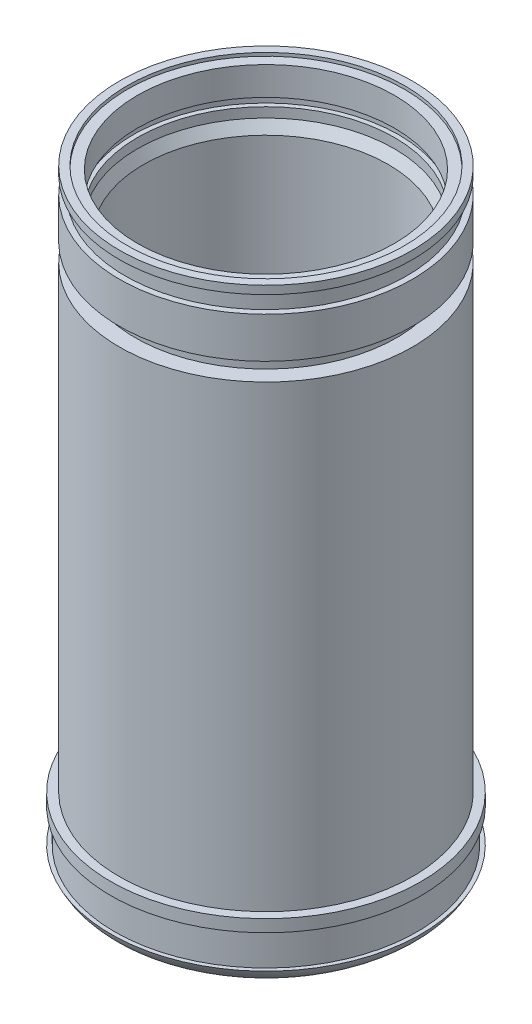
ISO-10303-21;
HEADER;
FILE_DESCRIPTION(('STEP AP214'),'2;1');
FILE_NAME('part.step','',(''),(''),'','','');
FILE_SCHEMA(('AUTOMOTIVE_DESIGN { 1 0 10303 214 1 1 1 1 }'));
ENDSEC;
DATA;
#1=APPLICATION_CONTEXT('core data for automotive mechanical design processes');
#2=APPLICATION_PROTOCOL_DEFINITION('international standard','automotive_design',2000,#1);
#3=PRODUCT_CONTEXT('',#1,'mechanical');
#4=PRODUCT('Part','Part','',(#3));
#5=PRODUCT_RELATED_PRODUCT_CATEGORY('part','',(#4));
#6=PRODUCT_DEFINITION_FORMATION('','',#4);
#7=PRODUCT_DEFINITION_CONTEXT('part definition',#1,'design');
#8=PRODUCT_DEFINITION('design','',#6,#7);
#9=PRODUCT_DEFINITION_SHAPE('','',#8);
#10=(LENGTH_UNIT() NAMED_UNIT(*) SI_UNIT(.MILLI.,.METRE.));
#11=(NAMED_UNIT(*) PLANE_ANGLE_UNIT() SI_UNIT($,.RADIAN.));
#12=(NAMED_UNIT(*) SI_UNIT($,.STERADIAN.) SOLID_ANGLE_UNIT());
#13=UNCERTAINTY_MEASURE_WITH_UNIT(LENGTH_MEASURE(1.E-05),#10,'distance_accuracy_value','');
#14=(GEOMETRIC_REPRESENTATION_CONTEXT(3) GLOBAL_UNCERTAINTY_ASSIGNED_CONTEXT((#13)) GLOBAL_UNIT_ASSIGNED_CONTEXT((#10,
#11,#12)) REPRESENTATION_CONTEXT('',''));
#15=CARTESIAN_POINT('',(0.,0.,0.));
#16=DIRECTION('',(0.,0.,1.));
#17=DIRECTION('',(1.,0.,0.));
#18=AXIS2_PLACEMENT_3D('',#15,#16,#17);
#19=CARTESIAN_POINT('',(0.,0.,0.));
#20=DIRECTION('',(0.,-1.,0.));
#21=DIRECTION('',(0.,0.,-1.));
#22=AXIS2_PLACEMENT_3D('',#19,#20,#21);
#23=CYLINDRICAL_SURFACE('',#22,28.7274);
#24=CARTESIAN_POINT('',(0.,7.9375,0.));
#25=DIRECTION('',(0.,-1.,0.));
#26=DIRECTION('',(0.,0.,-1.));
#27=AXIS2_PLACEMENT_3D('',#24,#25,#26);
#28=CIRCLE('',#27,28.7274);
#29=CARTESIAN_POINT('',(0.,7.9375,-28.7274));
#30=VERTEX_POINT('',#29);
#31=EDGE_CURVE('E166',#30,#30,#28,.T.);
#32=ORIENTED_EDGE('',*,*,#31,.T.);
#33=EDGE_LOOP('',(#32));
#34=FACE_BOUND('',#33,.T.);
#35=CARTESIAN_POINT('',(0.,11.1125,0.));
#36=DIRECTION('',(0.,-1.,0.));
#37=DIRECTION('',(0.,0.,-1.));
#38=AXIS2_PLACEMENT_3D('',#35,#36,#37);
#39=CIRCLE('',#38,28.7274);
#40=CARTESIAN_POINT('',(0.,11.1125,-28.7274));
#41=VERTEX_POINT('',#40);
#42=EDGE_CURVE('E64',#41,#41,#39,.T.);
#43=ORIENTED_EDGE('',*,*,#42,.F.);
#44=EDGE_LOOP('',(#43));
#45=FACE_BOUND('',#44,.T.);
#46=ADVANCED_FACE('F41',(#34,#45),#23,.F.);
#47=CARTESIAN_POINT('',(28.7274,11.1125,0.));
#48=DIRECTION('',(0.,1.,0.));
#49=DIRECTION('',(0.,0.,1.));
#50=AXIS2_PLACEMENT_3D('',#47,#48,#49);
#51=PLANE('',#50);
#52=ORIENTED_EDGE('',*,*,#42,.T.);
#53=EDGE_LOOP('',(#52));
#54=FACE_BOUND('',#53,.T.);
#55=CARTESIAN_POINT('',(0.,11.1125,0.));
#56=DIRECTION('',(0.,-1.,0.));
#57=DIRECTION('',(0.,0.,-1.));
#58=AXIS2_PLACEMENT_3D('',#55,#56,#57);
#59=CIRCLE('',#58,34.925);
#60=CARTESIAN_POINT('',(0.,11.1125,-34.925));
#61=VERTEX_POINT('',#60);
#62=EDGE_CURVE('E67',#61,#61,#59,.T.);
#63=ORIENTED_EDGE('',*,*,#62,.F.);
#64=EDGE_LOOP('',(#63));
#65=FACE_BOUND('',#64,.T.);
#66=ADVANCED_FACE('F188',(#54,#65),#51,.T.);
#67=CARTESIAN_POINT('',(0.,0.,0.));
#68=DIRECTION('',(0.,-1.,0.));
#69=DIRECTION('',(0.,0.,-1.));
#70=AXIS2_PLACEMENT_3D('',#67,#68,#69);
#71=CYLINDRICAL_SURFACE('',#70,34.925);
#72=ORIENTED_EDGE('',*,*,#62,.T.);
#73=EDGE_LOOP('',(#72));
#74=FACE_BOUND('',#73,.T.);
#75=CARTESIAN_POINT('',(0.,18.0975,0.));
#76=DIRECTION('',(0.,-1.,0.));
#77=DIRECTION('',(0.,0.,-1.));
#78=AXIS2_PLACEMENT_3D('',#75,#76,#77);
#79=CIRCLE('',#78,34.925);
#80=CARTESIAN_POINT('',(0.,18.0975,-34.925));
#81=VERTEX_POINT('',#80);
#82=EDGE_CURVE('E70',#81,#81,#79,.T.);
#83=ORIENTED_EDGE('',*,*,#82,.F.);
#84=EDGE_LOOP('',(#83));
#85=FACE_BOUND('',#84,.T.);
#86=ADVANCED_FACE('F193',(#74,#85),#71,.F.);
#87=CARTESIAN_POINT('',(34.925,18.0975,0.));
#88=DIRECTION('',(0.,-1.,0.));
#89=DIRECTION('',(0.,0.,-1.));
#90=AXIS2_PLACEMENT_3D('',#87,#88,#89);
#91=PLANE('',#90);
#92=ORIENTED_EDGE('',*,*,#82,.T.);
#93=EDGE_LOOP('',(#92));
#94=FACE_BOUND('',#93,.T.);
#95=CARTESIAN_POINT('',(0.,18.0975,0.));
#96=DIRECTION('',(0.,-1.,0.));
#97=DIRECTION('',(0.,0.,-1.));
#98=AXIS2_PLACEMENT_3D('',#95,#96,#97);
#99=CIRCLE('',#98,28.7274);
#100=CARTESIAN_POINT('',(0.,18.0975,-28.7274));
#101=VERTEX_POINT('',#100);
#102=EDGE_CURVE('E73',#101,#101,#99,.T.);
#103=ORIENTED_EDGE('',*,*,#102,.F.);
#104=EDGE_LOOP('',(#103));
#105=FACE_BOUND('',#104,.T.);
#106=ADVANCED_FACE('F331',(#94,#105),#91,.T.);
#107=CARTESIAN_POINT('',(0.,0.,0.));
#108=DIRECTION('',(0.,-1.,0.));
#109=DIRECTION('',(0.,0.,-1.));
#110=AXIS2_PLACEMENT_3D('',#107,#108,#109);
#111=CYLINDRICAL_SURFACE('',#110,28.7274);
#112=ORIENTED_EDGE('',*,*,#102,.T.);
#113=EDGE_LOOP('',(#112));
#114=FACE_BOUND('',#113,.T.);
#115=CARTESIAN_POINT('',(0.,19.685,0.));
#116=DIRECTION('',(0.,-1.,0.));
#117=DIRECTION('',(0.,0.,-1.));
#118=AXIS2_PLACEMENT_3D('',#115,#116,#117);
#119=CIRCLE('',#118,28.7274);
#120=CARTESIAN_POINT('',(0.,19.685,-28.7274));
#121=VERTEX_POINT('',#120);
#122=EDGE_CURVE('E76',#121,#121,#119,.T.);
#123=ORIENTED_EDGE('',*,*,#122,.F.);
#124=EDGE_LOOP('',(#123));
#125=FACE_BOUND('',#124,.T.);
#126=ADVANCED_FACE('F327',(#114,#125),#111,.F.);
#127=CARTESIAN_POINT('',(28.7274,19.685,0.));
#128=DIRECTION('',(0.,1.,0.));
#129=DIRECTION('',(0.,0.,1.));
#130=AXIS2_PLACEMENT_3D('',#127,#128,#129);
#131=PLANE('',#130);
#132=ORIENTED_EDGE('',*,*,#122,.T.);
#133=EDGE_LOOP('',(#132));
#134=FACE_BOUND('',#133,.T.);
#135=CARTESIAN_POINT('',(0.,19.685,0.));
#136=DIRECTION('',(0.,-1.,0.));
#137=DIRECTION('',(0.,0.,-1.));
#138=AXIS2_PLACEMENT_3D('',#135,#136,#137);
#139=CIRCLE('',#138,30.9499);
#140=CARTESIAN_POINT('',(0.,19.685,-30.9499));
#141=VERTEX_POINT('',#140);
#142=EDGE_CURVE('E79',#141,#141,#139,.T.);
#143=ORIENTED_EDGE('',*,*,#142,.F.);
#144=EDGE_LOOP('',(#143));
#145=FACE_BOUND('',#144,.T.);
#146=ADVANCED_FACE('F323',(#134,#145),#131,.T.);
#147=CARTESIAN_POINT('',(0.,0.,0.));
#148=DIRECTION('',(0.,-1.,0.));
#149=DIRECTION('',(0.,0.,-1.));
#150=AXIS2_PLACEMENT_3D('',#147,#148,#149);
#151=CYLINDRICAL_SURFACE('',#150,30.9499);
#152=ORIENTED_EDGE('',*,*,#142,.T.);
#153=EDGE_LOOP('',(#152));
#154=FACE_BOUND('',#153,.T.);
#155=CARTESIAN_POINT('',(0.,26.289,0.));
#156=DIRECTION('',(0.,-1.,0.));
#157=DIRECTION('',(0.,0.,-1.));
#158=AXIS2_PLACEMENT_3D('',#155,#156,#157);
#159=CIRCLE('',#158,30.9499);
#160=CARTESIAN_POINT('',(0.,26.289,-30.9499));
#161=VERTEX_POINT('',#160);
#162=EDGE_CURVE('E82',#161,#161,#159,.T.);
#163=ORIENTED_EDGE('',*,*,#162,.F.);
#164=EDGE_LOOP('',(#163));
#165=FACE_BOUND('',#164,.T.);
#166=ADVANCED_FACE('F319',(#154,#165),#151,.F.);
#167=CARTESIAN_POINT('',(30.9499,26.289,0.));
#168=DIRECTION('',(0.,-1.,0.));
#169=DIRECTION('',(0.,0.,-1.));
#170=AXIS2_PLACEMENT_3D('',#167,#168,#169);
#171=PLANE('',#170);
#172=ORIENTED_EDGE('',*,*,#162,.T.);
#173=EDGE_LOOP('',(#172));
#174=FACE_BOUND('',#173,.T.);
#175=CARTESIAN_POINT('',(0.,26.289,0.));
#176=DIRECTION('',(0.,-1.,0.));
#177=DIRECTION('',(0.,0.,-1.));
#178=AXIS2_PLACEMENT_3D('',#175,#176,#177);
#179=CIRCLE('',#178,28.7274);
#180=CARTESIAN_POINT('',(0.,26.289,-28.7274));
#181=VERTEX_POINT('',#180);
#182=EDGE_CURVE('E85',#181,#181,#179,.T.);
#183=ORIENTED_EDGE('',*,*,#182,.F.);
#184=EDGE_LOOP('',(#183));
#185=FACE_BOUND('',#184,.T.);
#186=ADVANCED_FACE('F315',(#174,#185),#171,.T.);
#187=CARTESIAN_POINT('',(0.,0.,0.));
#188=DIRECTION('',(0.,-1.,0.));
#189=DIRECTION('',(0.,0.,-1.));
#190=AXIS2_PLACEMENT_3D('',#187,#188,#189);
#191=CYLINDRICAL_SURFACE('',#190,28.7274);
#192=ORIENTED_EDGE('',*,*,#182,.T.);
#193=EDGE_LOOP('',(#192));
#194=FACE_BOUND('',#193,.T.);
#195=CARTESIAN_POINT('',(0.,26.9875,0.));
#196=DIRECTION('',(0.,-1.,0.));
#197=DIRECTION('',(0.,0.,-1.));
#198=AXIS2_PLACEMENT_3D('',#195,#196,#197);
#199=CIRCLE('',#198,28.7274);
#200=CARTESIAN_POINT('',(0.,26.9875,-28.7274));
#201=VERTEX_POINT('',#200);
#202=EDGE_CURVE('E88',#201,#201,#199,.T.);
#203=ORIENTED_EDGE('',*,*,#202,.F.);
#204=EDGE_LOOP('',(#203));
#205=FACE_BOUND('',#204,.T.);
#206=ADVANCED_FACE('F311',(#194,#205),#191,.F.);
#207=CARTESIAN_POINT('',(0.,30.1625,0.));
#208=DIRECTION('',(0.,1.,0.));
#209=DIRECTION('',(0.,0.,1.));
#210=AXIS2_PLACEMENT_3D('',#207,#208,#209);
#211=CONICAL_SURFACE('',#210,47.625,1.40434017573001);
#212=CARTESIAN_POINT('',(0.,29.7174497789455,0.));
#213=DIRECTION('',(0.,1.,0.));
#214=DIRECTION('',(0.,0.,1.));
#215=AXIS2_PLACEMENT_3D('',#212,#213,#214);
#216=CIRCLE('',#215,44.9760610842839);
#217=CARTESIAN_POINT('',(0.,29.7174497789455,44.9760610842839));
#218=VERTEX_POINT('',#217);
#219=EDGE_CURVE('E56',#218,#218,#216,.T.);
#220=ORIENTED_EDGE('',*,*,#219,.T.);
#221=EDGE_LOOP('',(#220));
#222=FACE_BOUND('',#221,.T.);
#223=ORIENTED_EDGE('',*,*,#202,.T.);
#224=EDGE_LOOP('',(#223));
#225=FACE_BOUND('',#224,.T.);
#226=ADVANCED_FACE('F307',(#222,#225),#211,.F.);
#227=CARTESIAN_POINT('',(0.,0.,0.));
#228=DIRECTION('',(0.,-1.,0.));
#229=DIRECTION('',(0.,0.,-1.));
#230=AXIS2_PLACEMENT_3D('',#227,#228,#229);
#231=CYLINDRICAL_SURFACE('',#230,47.625);
#232=CARTESIAN_POINT('',(0.,32.8485653526033,0.));
#233=DIRECTION('',(0.,-1.,0.));
#234=DIRECTION('',(0.,0.,-1.));
#235=AXIS2_PLACEMENT_3D('',#232,#233,#234);
#236=CIRCLE('',#235,47.625);
#237=CARTESIAN_POINT('',(0.,32.8485653526033,-47.625));
#238=VERTEX_POINT('',#237);
#239=EDGE_CURVE('E61',#238,#238,#236,.T.);
#240=ORIENTED_EDGE('',*,*,#239,.T.);
#241=EDGE_LOOP('',(#240));
#242=FACE_BOUND('',#241,.T.);
#243=CARTESIAN_POINT('',(0.,213.183379332024,0.));
#244=DIRECTION('',(0.,-1.,0.));
#245=DIRECTION('',(0.,0.,-1.));
#246=AXIS2_PLACEMENT_3D('',#243,#244,#245);
#247=CIRCLE('',#246,47.625);
#248=CARTESIAN_POINT('',(0.,213.183379332024,-47.625));
#249=VERTEX_POINT('',#248);
#250=EDGE_CURVE('E91',#249,#249,#247,.T.);
#251=ORIENTED_EDGE('',*,*,#250,.F.);
#252=EDGE_LOOP('',(#251));
#253=FACE_BOUND('',#252,.T.);
#254=ADVANCED_FACE('F303',(#242,#253),#231,.F.);
#255=CARTESIAN_POINT('',(0.,217.297,0.));
#256=DIRECTION('',(0.,1.,0.));
#257=DIRECTION('',(0.,0.,1.));
#258=AXIS2_PLACEMENT_3D('',#255,#256,#257);
#259=CONICAL_SURFACE('',#258,50.,0.5235987755983);
#260=ORIENTED_EDGE('',*,*,#250,.T.);
#261=EDGE_LOOP('',(#260));
#262=FACE_BOUND('',#261,.T.);
#263=CARTESIAN_POINT('',(0.,217.297,0.));
#264=DIRECTION('',(0.,-1.,0.));
#265=DIRECTION('',(0.,0.,-1.));
#266=AXIS2_PLACEMENT_3D('',#263,#264,#265);
#267=CIRCLE('',#266,50.);
#268=CARTESIAN_POINT('',(0.,217.297,-50.));
#269=VERTEX_POINT('',#268);
#270=EDGE_CURVE('E94',#269,#269,#267,.T.);
#271=ORIENTED_EDGE('',*,*,#270,.F.);
#272=EDGE_LOOP('',(#271));
#273=FACE_BOUND('',#272,.T.);
#274=ADVANCED_FACE('F299',(#262,#273),#259,.F.);
#275=CARTESIAN_POINT('',(0.,0.,0.));
#276=DIRECTION('',(0.,-1.,0.));
#277=DIRECTION('',(0.,0.,-1.));
#278=AXIS2_PLACEMENT_3D('',#275,#276,#277);
#279=CYLINDRICAL_SURFACE('',#278,50.);
#280=ORIENTED_EDGE('',*,*,#270,.T.);
#281=EDGE_LOOP('',(#280));
#282=FACE_BOUND('',#281,.T.);
#283=CARTESIAN_POINT('',(0.,221.107,0.));
#284=DIRECTION('',(0.,-1.,0.));
#285=DIRECTION('',(0.,0.,-1.));
#286=AXIS2_PLACEMENT_3D('',#283,#284,#285);
#287=CIRCLE('',#286,50.);
#288=CARTESIAN_POINT('',(0.,221.107,-50.));
#289=VERTEX_POINT('',#288);
#290=EDGE_CURVE('E97',#289,#289,#287,.T.);
#291=ORIENTED_EDGE('',*,*,#290,.F.);
#292=EDGE_LOOP('',(#291));
#293=FACE_BOUND('',#292,.T.);
#294=ADVANCED_FACE('F295',(#282,#293),#279,.F.);
#295=CARTESIAN_POINT('',(51.75,221.107,0.));
#296=DIRECTION('',(0.,1.,0.));
#297=DIRECTION('',(0.,0.,1.));
#298=AXIS2_PLACEMENT_3D('',#295,#296,#297);
#299=PLANE('',#298);
#300=ORIENTED_EDGE('',*,*,#290,.T.);
#301=EDGE_LOOP('',(#300));
#302=FACE_BOUND('',#301,.T.);
#303=CARTESIAN_POINT('',(0.,221.107,0.));
#304=DIRECTION('',(0.,-1.,0.));
#305=DIRECTION('',(0.,0.,-1.));
#306=AXIS2_PLACEMENT_3D('',#303,#304,#305);
#307=CIRCLE('',#306,51.75);
#308=CARTESIAN_POINT('',(0.,221.107,-51.75));
#309=VERTEX_POINT('',#308);
#310=EDGE_CURVE('E100',#309,#309,#307,.T.);
#311=ORIENTED_EDGE('',*,*,#310,.F.);
#312=EDGE_LOOP('',(#311));
#313=FACE_BOUND('',#312,.T.);
#314=ADVANCED_FACE('F291',(#302,#313),#299,.T.);
#315=CARTESIAN_POINT('',(0.,0.,0.));
#316=DIRECTION('',(0.,-1.,0.));
#317=DIRECTION('',(0.,0.,-1.));
#318=AXIS2_PLACEMENT_3D('',#315,#316,#317);
#319=CYLINDRICAL_SURFACE('',#318,51.75);
#320=ORIENTED_EDGE('',*,*,#310,.T.);
#321=EDGE_LOOP('',(#320));
#322=FACE_BOUND('',#321,.T.);
#323=CARTESIAN_POINT('',(0.,224.25700005,0.));
#324=DIRECTION('',(0.,-1.,0.));
#325=DIRECTION('',(0.,0.,-1.));
#326=AXIS2_PLACEMENT_3D('',#323,#324,#325);
#327=CIRCLE('',#326,51.75);
#328=CARTESIAN_POINT('',(0.,224.25700005,-51.75));
#329=VERTEX_POINT('',#328);
#330=EDGE_CURVE('E103',#329,#329,#327,.T.);
#331=ORIENTED_EDGE('',*,*,#330,.F.);
#332=EDGE_LOOP('',(#331));
#333=FACE_BOUND('',#332,.T.);
#334=ADVANCED_FACE('F287',(#322,#333),#319,.F.);
#335=CARTESIAN_POINT('',(50.,224.25700005,0.));
#336=DIRECTION('',(0.,-1.,0.));
#337=DIRECTION('',(0.,0.,-1.));
#338=AXIS2_PLACEMENT_3D('',#335,#336,#337);
#339=PLANE('',#338);
#340=ORIENTED_EDGE('',*,*,#330,.T.);
#341=EDGE_LOOP('',(#340));
#342=FACE_BOUND('',#341,.T.);
#343=CARTESIAN_POINT('',(0.,224.25700005,0.));
#344=DIRECTION('',(0.,-1.,0.));
#345=DIRECTION('',(0.,0.,-1.));
#346=AXIS2_PLACEMENT_3D('',#343,#344,#345);
#347=CIRCLE('',#346,50.);
#348=CARTESIAN_POINT('',(0.,224.25700005,-50.));
#349=VERTEX_POINT('',#348);
#350=EDGE_CURVE('E106',#349,#349,#347,.T.);
#351=ORIENTED_EDGE('',*,*,#350,.F.);
#352=EDGE_LOOP('',(#351));
#353=FACE_BOUND('',#352,.T.);
#354=ADVANCED_FACE('F283',(#342,#353),#339,.T.);
#355=CARTESIAN_POINT('',(0.,0.,0.));
#356=DIRECTION('',(0.,-1.,0.));
#357=DIRECTION('',(0.,0.,-1.));
#358=AXIS2_PLACEMENT_3D('',#355,#356,#357);
#359=CYLINDRICAL_SURFACE('',#358,50.);
#360=ORIENTED_EDGE('',*,*,#350,.T.);
#361=EDGE_LOOP('',(#360));
#362=FACE_BOUND('',#361,.T.);
#363=CARTESIAN_POINT('',(0.,235.331,0.));
#364=DIRECTION('',(0.,-1.,0.));
#365=DIRECTION('',(0.,0.,-1.));
#366=AXIS2_PLACEMENT_3D('',#363,#364,#365);
#367=CIRCLE('',#366,50.);
#368=CARTESIAN_POINT('',(0.,235.331,-50.));
#369=VERTEX_POINT('',#368);
#370=EDGE_CURVE('E109',#369,#369,#367,.T.);
#371=ORIENTED_EDGE('',*,*,#370,.F.);
#372=EDGE_LOOP('',(#371));
#373=FACE_BOUND('',#372,.T.);
#374=ADVANCED_FACE('F279',(#362,#373),#359,.F.);
#375=CARTESIAN_POINT('',(50.,235.331,0.));
#376=DIRECTION('',(0.,1.,0.));
#377=DIRECTION('',(0.,0.,1.));
#378=AXIS2_PLACEMENT_3D('',#375,#376,#377);
#379=PLANE('',#378);
#380=ORIENTED_EDGE('',*,*,#370,.T.);
#381=EDGE_LOOP('',(#380));
#382=FACE_BOUND('',#381,.T.);
#383=CARTESIAN_POINT('',(0.,235.331,0.));
#384=DIRECTION('',(0.,-1.,0.));
#385=DIRECTION('',(0.,0.,-1.));
#386=AXIS2_PLACEMENT_3D('',#383,#384,#385);
#387=CIRCLE('',#386,53.975);
#388=CARTESIAN_POINT('',(0.,235.331,-53.975));
#389=VERTEX_POINT('',#388);
#390=EDGE_CURVE('E112',#389,#389,#387,.T.);
#391=ORIENTED_EDGE('',*,*,#390,.F.);
#392=EDGE_LOOP('',(#391));
#393=FACE_BOUND('',#392,.T.);
#394=ADVANCED_FACE('F275',(#382,#393),#379,.T.);
#395=CARTESIAN_POINT('',(0.,0.,0.));
#396=DIRECTION('',(0.,-1.,0.));
#397=DIRECTION('',(0.,0.,-1.));
#398=AXIS2_PLACEMENT_3D('',#395,#396,#397);
#399=CYLINDRICAL_SURFACE('',#398,53.975);
#400=ORIENTED_EDGE('',*,*,#390,.T.);
#401=EDGE_LOOP('',(#400));
#402=FACE_BOUND('',#401,.T.);
#403=CARTESIAN_POINT('',(0.,236.601,0.));
#404=DIRECTION('',(0.,-1.,0.));
#405=DIRECTION('',(0.,0.,-1.));
#406=AXIS2_PLACEMENT_3D('',#403,#404,#405);
#407=CIRCLE('',#406,53.975);
#408=CARTESIAN_POINT('',(0.,236.601,-53.975));
#409=VERTEX_POINT('',#408);
#410=EDGE_CURVE('E115',#409,#409,#407,.T.);
#411=ORIENTED_EDGE('',*,*,#410,.F.);
#412=EDGE_LOOP('',(#411));
#413=FACE_BOUND('',#412,.T.);
#414=ADVANCED_FACE('F271',(#402,#413),#399,.F.);
#415=CARTESIAN_POINT('',(53.975,236.601,0.));
#416=DIRECTION('',(0.,1.,0.));
#417=DIRECTION('',(0.,0.,1.));
#418=AXIS2_PLACEMENT_3D('',#415,#416,#417);
#419=PLANE('',#418);
#420=ORIENTED_EDGE('',*,*,#410,.T.);
#421=EDGE_LOOP('',(#420));
#422=FACE_BOUND('',#421,.T.);
#423=CARTESIAN_POINT('',(0.,236.601,0.));
#424=DIRECTION('',(0.,-1.,0.));
#425=DIRECTION('',(0.,0.,-1.));
#426=AXIS2_PLACEMENT_3D('',#423,#424,#425);
#427=CIRCLE('',#426,57.0611);
#428=CARTESIAN_POINT('',(0.,236.601,-57.0611));
#429=VERTEX_POINT('',#428);
#430=EDGE_CURVE('E118',#429,#429,#427,.T.);
#431=ORIENTED_EDGE('',*,*,#430,.F.);
#432=EDGE_LOOP('',(#431));
#433=FACE_BOUND('',#432,.T.);
#434=ADVANCED_FACE('F267',(#422,#433),#419,.T.);
#435=CARTESIAN_POINT('',(0.,0.,0.));
#436=DIRECTION('',(0.,-1.,0.));
#437=DIRECTION('',(0.,0.,-1.));
#438=AXIS2_PLACEMENT_3D('',#435,#436,#437);
#439=CYLINDRICAL_SURFACE('',#438,57.0611);
#440=ORIENTED_EDGE('',*,*,#430,.T.);
#441=EDGE_LOOP('',(#440));
#442=FACE_BOUND('',#441,.T.);
#443=CARTESIAN_POINT('',(0.,233.426,0.));
#444=DIRECTION('',(0.,-1.,0.));
#445=DIRECTION('',(0.,0.,-1.));
#446=AXIS2_PLACEMENT_3D('',#443,#444,#445);
#447=CIRCLE('',#446,57.0611);
#448=CARTESIAN_POINT('',(0.,233.426,-57.0611));
#449=VERTEX_POINT('',#448);
#450=EDGE_CURVE('E121',#449,#449,#447,.T.);
#451=ORIENTED_EDGE('',*,*,#450,.F.);
#452=EDGE_LOOP('',(#451));
#453=FACE_BOUND('',#452,.T.);
#454=ADVANCED_FACE('F263',(#442,#453),#439,.T.);
#455=CARTESIAN_POINT('',(57.0611,233.426,0.));
#456=DIRECTION('',(0.,-1.,0.));
#457=DIRECTION('',(0.,0.,-1.));
#458=AXIS2_PLACEMENT_3D('',#455,#456,#457);
#459=PLANE('',#458);
#460=ORIENTED_EDGE('',*,*,#450,.T.);
#461=EDGE_LOOP('',(#460));
#462=FACE_BOUND('',#461,.T.);
#463=CARTESIAN_POINT('',(0.,233.426,0.));
#464=DIRECTION('',(0.,-1.,0.));
#465=DIRECTION('',(0.,0.,-1.));
#466=AXIS2_PLACEMENT_3D('',#463,#464,#465);
#467=CIRCLE('',#466,54.8386000000002);
#468=CARTESIAN_POINT('',(0.,233.426,-54.8386000000002));
#469=VERTEX_POINT('',#468);
#470=EDGE_CURVE('E124',#469,#469,#467,.T.);
#471=ORIENTED_EDGE('',*,*,#470,.F.);
#472=EDGE_LOOP('',(#471));
#473=FACE_BOUND('',#472,.T.);
#474=ADVANCED_FACE('F259',(#462,#473),#459,.T.);
#475=CARTESIAN_POINT('',(0.,0.,0.));
#476=DIRECTION('',(0.,-1.,0.));
#477=DIRECTION('',(0.,0.,-1.));
#478=AXIS2_PLACEMENT_3D('',#475,#476,#477);
#479=CYLINDRICAL_SURFACE('',#478,54.8386000000002);
#480=ORIENTED_EDGE('',*,*,#470,.T.);
#481=EDGE_LOOP('',(#480));
#482=FACE_BOUND('',#481,.T.);
#483=CARTESIAN_POINT('',(0.,226.822,0.));
#484=DIRECTION('',(0.,-1.,0.));
#485=DIRECTION('',(0.,0.,-1.));
#486=AXIS2_PLACEMENT_3D('',#483,#484,#485);
#487=CIRCLE('',#486,54.8386000000002);
#488=CARTESIAN_POINT('',(0.,226.822,-54.8386000000002));
#489=VERTEX_POINT('',#488);
#490=EDGE_CURVE('E127',#489,#489,#487,.T.);
#491=ORIENTED_EDGE('',*,*,#490,.F.);
#492=EDGE_LOOP('',(#491));
#493=FACE_BOUND('',#492,.T.);
#494=ADVANCED_FACE('F255',(#482,#493),#479,.T.);
#495=CARTESIAN_POINT('',(54.8386000000002,226.822,0.));
#496=DIRECTION('',(0.,1.,0.));
#497=DIRECTION('',(0.,0.,1.));
#498=AXIS2_PLACEMENT_3D('',#495,#496,#497);
#499=PLANE('',#498);
#500=ORIENTED_EDGE('',*,*,#490,.T.);
#501=EDGE_LOOP('',(#500));
#502=FACE_BOUND('',#501,.T.);
#503=CARTESIAN_POINT('',(0.,226.822,0.));
#504=DIRECTION('',(0.,-1.,0.));
#505=DIRECTION('',(0.,0.,-1.));
#506=AXIS2_PLACEMENT_3D('',#503,#504,#505);
#507=CIRCLE('',#506,57.0611);
#508=CARTESIAN_POINT('',(0.,226.822,-57.0611));
#509=VERTEX_POINT('',#508);
#510=EDGE_CURVE('E130',#509,#509,#507,.T.);
#511=ORIENTED_EDGE('',*,*,#510,.F.);
#512=EDGE_LOOP('',(#511));
#513=FACE_BOUND('',#512,.T.);
#514=ADVANCED_FACE('F251',(#502,#513),#499,.T.);
#515=CARTESIAN_POINT('',(0.,0.,0.));
#516=DIRECTION('',(0.,-1.,0.));
#517=DIRECTION('',(0.,0.,-1.));
#518=AXIS2_PLACEMENT_3D('',#515,#516,#517);
#519=CYLINDRICAL_SURFACE('',#518,57.0611);
#520=ORIENTED_EDGE('',*,*,#510,.T.);
#521=EDGE_LOOP('',(#520));
#522=FACE_BOUND('',#521,.T.);
#523=CARTESIAN_POINT('',(0.,210.947,0.));
#524=DIRECTION('',(0.,-1.,0.));
#525=DIRECTION('',(0.,0.,-1.));
#526=AXIS2_PLACEMENT_3D('',#523,#524,#525);
#527=CIRCLE('',#526,57.0611);
#528=CARTESIAN_POINT('',(0.,210.947,-57.0611));
#529=VERTEX_POINT('',#528);
#530=EDGE_CURVE('E133',#529,#529,#527,.T.);
#531=ORIENTED_EDGE('',*,*,#530,.F.);
#532=EDGE_LOOP('',(#531));
#533=FACE_BOUND('',#532,.T.);
#534=ADVANCED_FACE('F247',(#522,#533),#519,.T.);
#535=CARTESIAN_POINT('',(57.0611,210.947,0.));
#536=DIRECTION('',(0.,-1.,0.));
#537=DIRECTION('',(0.,0.,-1.));
#538=AXIS2_PLACEMENT_3D('',#535,#536,#537);
#539=PLANE('',#538);
#540=ORIENTED_EDGE('',*,*,#530,.T.);
#541=EDGE_LOOP('',(#540));
#542=FACE_BOUND('',#541,.T.);
#543=CARTESIAN_POINT('',(0.,210.947,0.));
#544=DIRECTION('',(0.,-1.,0.));
#545=DIRECTION('',(0.,0.,-1.));
#546=AXIS2_PLACEMENT_3D('',#543,#544,#545);
#547=CIRCLE('',#546,50.8635);
#548=CARTESIAN_POINT('',(0.,210.947,-50.8635));
#549=VERTEX_POINT('',#548);
#550=EDGE_CURVE('E136',#549,#549,#547,.T.);
#551=ORIENTED_EDGE('',*,*,#550,.F.);
#552=EDGE_LOOP('',(#551));
#553=FACE_BOUND('',#552,.T.);
#554=ADVANCED_FACE('F243',(#542,#553),#539,.T.);
#555=CARTESIAN_POINT('',(0.,0.,0.));
#556=DIRECTION('',(0.,-1.,0.));
#557=DIRECTION('',(0.,0.,-1.));
#558=AXIS2_PLACEMENT_3D('',#555,#556,#557);
#559=CYLINDRICAL_SURFACE('',#558,50.8635);
#560=ORIENTED_EDGE('',*,*,#550,.T.);
#561=EDGE_LOOP('',(#560));
#562=FACE_BOUND('',#561,.T.);
#563=CARTESIAN_POINT('',(0.,203.962,0.));
#564=DIRECTION('',(0.,-1.,0.));
#565=DIRECTION('',(0.,0.,-1.));
#566=AXIS2_PLACEMENT_3D('',#563,#564,#565);
#567=CIRCLE('',#566,50.8635);
#568=CARTESIAN_POINT('',(0.,203.962,-50.8635));
#569=VERTEX_POINT('',#568);
#570=EDGE_CURVE('E139',#569,#569,#567,.T.);
#571=ORIENTED_EDGE('',*,*,#570,.F.);
#572=EDGE_LOOP('',(#571));
#573=FACE_BOUND('',#572,.T.);
#574=ADVANCED_FACE('F239',(#562,#573),#559,.T.);
#575=CARTESIAN_POINT('',(50.8635,203.962,0.));
#576=DIRECTION('',(0.,1.,0.));
#577=DIRECTION('',(0.,0.,1.));
#578=AXIS2_PLACEMENT_3D('',#575,#576,#577);
#579=PLANE('',#578);
#580=ORIENTED_EDGE('',*,*,#570,.T.);
#581=EDGE_LOOP('',(#580));
#582=FACE_BOUND('',#581,.T.);
#583=CARTESIAN_POINT('',(0.,203.962,0.));
#584=DIRECTION('',(0.,-1.,0.));
#585=DIRECTION('',(0.,0.,-1.));
#586=AXIS2_PLACEMENT_3D('',#583,#584,#585);
#587=CIRCLE('',#586,57.0611);
#588=CARTESIAN_POINT('',(0.,203.962,-57.0611));
#589=VERTEX_POINT('',#588);
#590=EDGE_CURVE('E142',#589,#589,#587,.T.);
#591=ORIENTED_EDGE('',*,*,#590,.F.);
#592=EDGE_LOOP('',(#591));
#593=FACE_BOUND('',#592,.T.);
#594=ADVANCED_FACE('F235',(#582,#593),#579,.T.);
#595=CARTESIAN_POINT('',(0.,0.,0.));
#596=DIRECTION('',(0.,-1.,0.));
#597=DIRECTION('',(0.,0.,-1.));
#598=AXIS2_PLACEMENT_3D('',#595,#596,#597);
#599=CYLINDRICAL_SURFACE('',#598,57.0611);
#600=ORIENTED_EDGE('',*,*,#590,.T.);
#601=EDGE_LOOP('',(#600));
#602=FACE_BOUND('',#601,.T.);
#603=CARTESIAN_POINT('',(0.,25.4,0.));
#604=DIRECTION('',(0.,-1.,0.));
#605=DIRECTION('',(0.,0.,-1.));
#606=AXIS2_PLACEMENT_3D('',#603,#604,#605);
#607=CIRCLE('',#606,57.0611);
#608=CARTESIAN_POINT('',(0.,25.4,-57.0611));
#609=VERTEX_POINT('',#608);
#610=EDGE_CURVE('E145',#609,#609,#607,.T.);
#611=ORIENTED_EDGE('',*,*,#610,.F.);
#612=EDGE_LOOP('',(#611));
#613=FACE_BOUND('',#612,.T.);
#614=ADVANCED_FACE('F231',(#602,#613),#599,.T.);
#615=CARTESIAN_POINT('',(57.0611,25.4,0.));
#616=DIRECTION('',(0.,1.,0.));
#617=DIRECTION('',(0.,0.,1.));
#618=AXIS2_PLACEMENT_3D('',#615,#616,#617);
#619=PLANE('',#618);
#620=ORIENTED_EDGE('',*,*,#610,.T.);
#621=EDGE_LOOP('',(#620));
#622=FACE_BOUND('',#621,.T.);
#623=CARTESIAN_POINT('',(0.,25.4,0.));
#624=DIRECTION('',(0.,-1.,0.));
#625=DIRECTION('',(0.,0.,-1.));
#626=AXIS2_PLACEMENT_3D('',#623,#624,#625);
#627=CIRCLE('',#626,60.3885);
#628=CARTESIAN_POINT('',(0.,25.4,-60.3885));
#629=VERTEX_POINT('',#628);
#630=EDGE_CURVE('E148',#629,#629,#627,.T.);
#631=ORIENTED_EDGE('',*,*,#630,.F.);
#632=EDGE_LOOP('',(#631));
#633=FACE_BOUND('',#632,.T.);
#634=ADVANCED_FACE('F227',(#622,#633),#619,.T.);
#635=CARTESIAN_POINT('',(0.,0.,0.));
#636=DIRECTION('',(0.,-1.,0.));
#637=DIRECTION('',(0.,0.,-1.));
#638=AXIS2_PLACEMENT_3D('',#635,#636,#637);
#639=CYLINDRICAL_SURFACE('',#638,60.3885);
#640=ORIENTED_EDGE('',*,*,#630,.T.);
#641=EDGE_LOOP('',(#640));
#642=FACE_BOUND('',#641,.T.);
#643=CARTESIAN_POINT('',(0.,20.6375,0.));
#644=DIRECTION('',(0.,-1.,0.));
#645=DIRECTION('',(0.,0.,-1.));
#646=AXIS2_PLACEMENT_3D('',#643,#644,#645);
#647=CIRCLE('',#646,60.3885);
#648=CARTESIAN_POINT('',(0.,20.6375,-60.3885));
#649=VERTEX_POINT('',#648);
#650=EDGE_CURVE('E151',#649,#649,#647,.T.);
#651=ORIENTED_EDGE('',*,*,#650,.F.);
#652=EDGE_LOOP('',(#651));
#653=FACE_BOUND('',#652,.T.);
#654=ADVANCED_FACE('F223',(#642,#653),#639,.T.);
#655=CARTESIAN_POINT('',(60.3885,20.6375,0.));
#656=DIRECTION('',(0.,-1.,0.));
#657=DIRECTION('',(0.,0.,-1.));
#658=AXIS2_PLACEMENT_3D('',#655,#656,#657);
#659=PLANE('',#658);
#660=ORIENTED_EDGE('',*,*,#650,.T.);
#661=EDGE_LOOP('',(#660));
#662=FACE_BOUND('',#661,.T.);
#663=CARTESIAN_POINT('',(0.,20.6375,0.));
#664=DIRECTION('',(0.,-1.,0.));
#665=DIRECTION('',(0.,0.,-1.));
#666=AXIS2_PLACEMENT_3D('',#663,#664,#665);
#667=CIRCLE('',#666,58.8645);
#668=CARTESIAN_POINT('',(0.,20.6375,-58.8645));
#669=VERTEX_POINT('',#668);
#670=EDGE_CURVE('E154',#669,#669,#667,.T.);
#671=ORIENTED_EDGE('',*,*,#670,.F.);
#672=EDGE_LOOP('',(#671));
#673=FACE_BOUND('',#672,.T.);
#674=ADVANCED_FACE('F219',(#662,#673),#659,.T.);
#675=CARTESIAN_POINT('',(0.,0.,0.));
#676=DIRECTION('',(0.,-1.,0.));
#677=DIRECTION('',(0.,0.,-1.));
#678=AXIS2_PLACEMENT_3D('',#675,#676,#677);
#679=CYLINDRICAL_SURFACE('',#678,58.8645);
#680=ORIENTED_EDGE('',*,*,#670,.T.);
#681=EDGE_LOOP('',(#680));
#682=FACE_BOUND('',#681,.T.);
#683=CARTESIAN_POINT('',(0.,7.68350000000001,0.));
#684=DIRECTION('',(0.,-1.,0.));
#685=DIRECTION('',(0.,0.,-1.));
#686=AXIS2_PLACEMENT_3D('',#683,#684,#685);
#687=CIRCLE('',#686,58.8645);
#688=CARTESIAN_POINT('',(0.,7.68350000000001,-58.8645));
#689=VERTEX_POINT('',#688);
#690=EDGE_CURVE('E157',#689,#689,#687,.T.);
#691=ORIENTED_EDGE('',*,*,#690,.F.);
#692=EDGE_LOOP('',(#691));
#693=FACE_BOUND('',#692,.T.);
#694=ADVANCED_FACE('F213',(#682,#693),#679,.T.);
#695=CARTESIAN_POINT('',(58.8645,7.68350000000001,0.));
#696=DIRECTION('',(0.,1.,0.));
#697=DIRECTION('',(0.,0.,1.));
#698=AXIS2_PLACEMENT_3D('',#695,#696,#697);
#699=PLANE('',#698);
#700=ORIENTED_EDGE('',*,*,#690,.T.);
#701=EDGE_LOOP('',(#700));
#702=FACE_BOUND('',#701,.T.);
#703=CARTESIAN_POINT('',(0.,7.68350000000001,0.));
#704=DIRECTION('',(0.,-1.,0.));
#705=DIRECTION('',(0.,0.,-1.));
#706=AXIS2_PLACEMENT_3D('',#703,#704,#705);
#707=CIRCLE('',#706,60.3885);
#708=CARTESIAN_POINT('',(0.,7.68350000000001,-60.3885));
#709=VERTEX_POINT('',#708);
#710=EDGE_CURVE('E160',#709,#709,#707,.T.);
#711=ORIENTED_EDGE('',*,*,#710,.F.);
#712=EDGE_LOOP('',(#711));
#713=FACE_BOUND('',#712,.T.);
#714=ADVANCED_FACE('F208',(#702,#713),#699,.T.);
#715=CARTESIAN_POINT('',(60.3885,0.,0.));
#716=DIRECTION('',(0.,-1.,0.));
#717=DIRECTION('',(0.,0.,-1.));
#718=AXIS2_PLACEMENT_3D('',#715,#716,#717);
#719=PLANE('',#718);
#720=CARTESIAN_POINT('',(0.,0.,0.));
#721=DIRECTION('',(0.,-1.,0.));
#722=DIRECTION('',(0.,0.,-1.));
#723=AXIS2_PLACEMENT_3D('',#720,#721,#722);
#724=CIRCLE('',#723,32.54375);
#725=CARTESIAN_POINT('',(0.,0.,-32.54375));
#726=VERTEX_POINT('',#725);
#727=EDGE_CURVE('E10',#726,#726,#724,.F.);
#728=ORIENTED_EDGE('',*,*,#727,.T.);
#729=EDGE_LOOP('',(#728));
#730=FACE_BOUND('',#729,.T.);
#731=CARTESIAN_POINT('',(0.,0.,0.));
#732=DIRECTION('',(0.,-1.,0.));
#733=DIRECTION('',(0.,0.,-1.));
#734=AXIS2_PLACEMENT_3D('',#731,#732,#733);
#735=CIRCLE('',#734,48.7212497776897);
#736=CARTESIAN_POINT('',(0.,0.,-48.7212497776897));
#737=VERTEX_POINT('',#736);
#738=EDGE_CURVE('E52',#737,#737,#735,.T.);
#739=ORIENTED_EDGE('',*,*,#738,.T.);
#740=EDGE_LOOP('',(#739));
#741=FACE_BOUND('',#740,.T.);
#742=ADVANCED_FACE('F185',(#730,#741),#719,.T.);
#743=CARTESIAN_POINT('',(0.,0.,0.));
#744=DIRECTION('',(0.,-1.,0.));
#745=DIRECTION('',(0.,0.,-1.));
#746=AXIS2_PLACEMENT_3D('',#743,#744,#745);
#747=CYLINDRICAL_SURFACE('',#746,29.36875);
#748=CARTESIAN_POINT('',(0.,3.175,0.));
#749=DIRECTION('',(0.,-1.,0.));
#750=DIRECTION('',(0.,0.,-1.));
#751=AXIS2_PLACEMENT_3D('',#748,#749,#750);
#752=CIRCLE('',#751,29.36875);
#753=CARTESIAN_POINT('',(0.,3.175,-29.36875));
#754=VERTEX_POINT('',#753);
#755=EDGE_CURVE('E48',#754,#754,#752,.T.);
#756=ORIENTED_EDGE('',*,*,#755,.T.);
#757=EDGE_LOOP('',(#756));
#758=FACE_BOUND('',#757,.T.);
#759=CARTESIAN_POINT('',(0.,7.9375,0.));
#760=DIRECTION('',(0.,-1.,0.));
#761=DIRECTION('',(0.,0.,-1.));
#762=AXIS2_PLACEMENT_3D('',#759,#760,#761);
#763=CIRCLE('',#762,29.36875);
#764=CARTESIAN_POINT('',(0.,7.9375,-29.36875));
#765=VERTEX_POINT('',#764);
#766=EDGE_CURVE('E163',#765,#765,#763,.T.);
#767=ORIENTED_EDGE('',*,*,#766,.F.);
#768=EDGE_LOOP('',(#767));
#769=FACE_BOUND('',#768,.T.);
#770=ADVANCED_FACE('F175',(#758,#769),#747,.F.);
#771=CARTESIAN_POINT('',(28.7274,7.9375,0.));
#772=DIRECTION('',(0.,-1.,0.));
#773=DIRECTION('',(0.,0.,-1.));
#774=AXIS2_PLACEMENT_3D('',#771,#772,#773);
#775=PLANE('',#774);
#776=ORIENTED_EDGE('',*,*,#766,.T.);
#777=EDGE_LOOP('',(#776));
#778=FACE_BOUND('',#777,.T.);
#779=ORIENTED_EDGE('',*,*,#31,.F.);
#780=EDGE_LOOP('',(#779));
#781=FACE_BOUND('',#780,.T.);
#782=ADVANCED_FACE('F172',(#778,#781),#775,.T.);
#783=CARTESIAN_POINT('',(0.,32.8485653526033,0.));
#784=DIRECTION('',(0.,-1.,0.));
#785=DIRECTION('',(0.,0.,-1.));
#786=AXIS2_PLACEMENT_3D('',#783,#784,#785);
#787=TOROIDAL_SURFACE('',#786,44.45,3.175);
#788=ORIENTED_EDGE('',*,*,#219,.F.);
#789=EDGE_LOOP('',(#788));
#790=FACE_BOUND('',#789,.T.);
#791=ORIENTED_EDGE('',*,*,#239,.F.);
#792=EDGE_LOOP('',(#791));
#793=FACE_BOUND('',#792,.T.);
#794=ADVANCED_FACE('F174',(#790,#793),#787,.F.);
#795=CARTESIAN_POINT('',(0.,12.7,0.));
#796=DIRECTION('',(0.,1.,0.));
#797=DIRECTION('',(0.,0.,1.));
#798=AXIS2_PLACEMENT_3D('',#795,#796,#797);
#799=TOROIDAL_SURFACE('',#798,48.7212497776897,12.7);
#800=ORIENTED_EDGE('',*,*,#710,.T.);
#801=EDGE_LOOP('',(#800));
#802=FACE_BOUND('',#801,.T.);
#803=ORIENTED_EDGE('',*,*,#738,.F.);
#804=EDGE_LOOP('',(#803));
#805=FACE_BOUND('',#804,.T.);
#806=ADVANCED_FACE('F182',(#802,#805),#799,.T.);
#807=CARTESIAN_POINT('',(0.,3.175,0.));
#808=DIRECTION('',(0.,-1.,0.));
#809=DIRECTION('',(0.,0.,-1.));
#810=AXIS2_PLACEMENT_3D('',#807,#808,#809);
#811=TOROIDAL_SURFACE('',#810,32.54375,3.175);
#812=ORIENTED_EDGE('',*,*,#727,.F.);
#813=EDGE_LOOP('',(#812));
#814=FACE_BOUND('',#813,.T.);
#815=ORIENTED_EDGE('',*,*,#755,.F.);
#816=EDGE_LOOP('',(#815));
#817=FACE_BOUND('',#816,.T.);
#818=ADVANCED_FACE('F43',(#814,#817),#811,.T.);
#819=CLOSED_SHELL('',(#46,#66,#86,#106,#126,#146,#166,#186,#206,#226,#254,#274,#294,#314,#334,
#354,#374,#394,#414,#434,#454,#474,#494,#514,#534,#554,#574,#594,#614,#634,#654,#674,#694,#714,
#742,#770,#782,#794,#806,#818));
#820=MANIFOLD_SOLID_BREP('B2',#819);
#821=ADVANCED_BREP_SHAPE_REPRESENTATION('',(#18,#820),#14);
#822=SHAPE_DEFINITION_REPRESENTATION(#9,#821);
ENDSEC;
END-ISO-10303-21;
